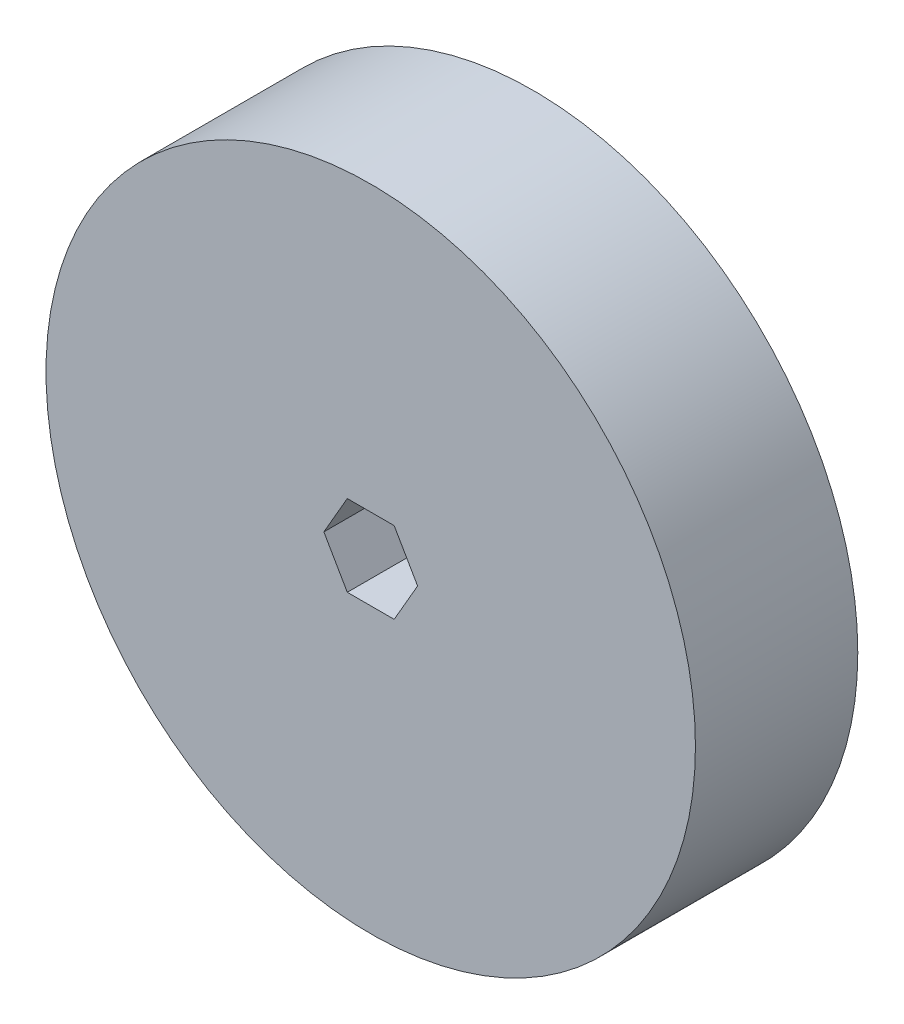
ISO-10303-21;
HEADER;
FILE_DESCRIPTION(('STEP AP214'),'2;1');
FILE_NAME('part.step','',(''),(''),'','','');
FILE_SCHEMA(('AUTOMOTIVE_DESIGN { 1 0 10303 214 1 1 1 1 }'));
ENDSEC;
DATA;
#1=APPLICATION_CONTEXT('core data for automotive mechanical design processes');
#2=APPLICATION_PROTOCOL_DEFINITION('international standard','automotive_design',2000,#1);
#3=PRODUCT_CONTEXT('',#1,'mechanical');
#4=PRODUCT('Part','Part','',(#3));
#5=PRODUCT_RELATED_PRODUCT_CATEGORY('part','',(#4));
#6=PRODUCT_DEFINITION_FORMATION('','',#4);
#7=PRODUCT_DEFINITION_CONTEXT('part definition',#1,'design');
#8=PRODUCT_DEFINITION('design','',#6,#7);
#9=PRODUCT_DEFINITION_SHAPE('','',#8);
#10=(LENGTH_UNIT() NAMED_UNIT(*) SI_UNIT(.MILLI.,.METRE.));
#11=(NAMED_UNIT(*) PLANE_ANGLE_UNIT() SI_UNIT($,.RADIAN.));
#12=(NAMED_UNIT(*) SI_UNIT($,.STERADIAN.) SOLID_ANGLE_UNIT());
#13=UNCERTAINTY_MEASURE_WITH_UNIT(LENGTH_MEASURE(1.E-05),#10,'distance_accuracy_value','');
#14=(GEOMETRIC_REPRESENTATION_CONTEXT(3) GLOBAL_UNCERTAINTY_ASSIGNED_CONTEXT((#13)) GLOBAL_UNIT_ASSIGNED_CONTEXT((#10,
#11,#12)) REPRESENTATION_CONTEXT('',''));
#15=CARTESIAN_POINT('',(0.,0.,0.));
#16=DIRECTION('',(0.,0.,1.));
#17=DIRECTION('',(1.,0.,0.));
#18=AXIS2_PLACEMENT_3D('',#15,#16,#17);
#19=CARTESIAN_POINT('',(0.,0.,25.4));
#20=DIRECTION('',(0.,0.,1.));
#21=DIRECTION('',(1.,0.,0.));
#22=AXIS2_PLACEMENT_3D('',#19,#20,#21);
#23=PLANE('',#22);
#24=CARTESIAN_POINT('',(0.,0.,25.4));
#25=DIRECTION('',(0.,0.,1.));
#26=DIRECTION('',(1.,0.,0.));
#27=AXIS2_PLACEMENT_3D('',#24,#25,#26);
#28=CIRCLE('',#27,50.8);
#29=CARTESIAN_POINT('',(50.8,0.,25.4));
#30=VERTEX_POINT('',#29);
#31=EDGE_CURVE('E11',#30,#30,#28,.T.);
#32=ORIENTED_EDGE('',*,*,#31,.T.);
#33=EDGE_LOOP('',(#32));
#34=FACE_BOUND('',#33,.T.);
#35=DIRECTION('',(-0.5,-0.866025403784438,0.));
#36=VECTOR('',#35,1.);
#37=CARTESIAN_POINT('',(-3.66617420935412,6.35,25.4));
#38=LINE('',#37,#36);
#39=CARTESIAN_POINT('',(-3.66617420935412,6.35,25.4));
#40=VERTEX_POINT('',#39);
#41=CARTESIAN_POINT('',(-7.33234841870825,0.,25.4));
#42=VERTEX_POINT('',#41);
#43=EDGE_CURVE('E106',#40,#42,#38,.T.);
#44=ORIENTED_EDGE('',*,*,#43,.F.);
#45=DIRECTION('',(-1.,0.,0.));
#46=VECTOR('',#45,1.);
#47=CARTESIAN_POINT('',(3.66617420935412,6.35,25.4));
#48=LINE('',#47,#46);
#49=CARTESIAN_POINT('',(3.66617420935412,6.35,25.4));
#50=VERTEX_POINT('',#49);
#51=EDGE_CURVE('E97',#50,#40,#48,.T.);
#52=ORIENTED_EDGE('',*,*,#51,.F.);
#53=DIRECTION('',(-0.5,0.866025403784439,0.));
#54=VECTOR('',#53,1.);
#55=CARTESIAN_POINT('',(7.33234841870825,0.,25.4));
#56=LINE('',#55,#54);
#57=CARTESIAN_POINT('',(7.33234841870825,0.,25.4));
#58=VERTEX_POINT('',#57);
#59=EDGE_CURVE('E131',#58,#50,#56,.T.);
#60=ORIENTED_EDGE('',*,*,#59,.F.);
#61=DIRECTION('',(0.5,0.866025403784438,0.));
#62=VECTOR('',#61,1.);
#63=CARTESIAN_POINT('',(3.66617420935413,-6.35,25.4));
#64=LINE('',#63,#62);
#65=CARTESIAN_POINT('',(3.66617420935413,-6.35,25.4));
#66=VERTEX_POINT('',#65);
#67=EDGE_CURVE('E128',#66,#58,#64,.T.);
#68=ORIENTED_EDGE('',*,*,#67,.F.);
#69=DIRECTION('',(1.,0.,0.));
#70=VECTOR('',#69,1.);
#71=CARTESIAN_POINT('',(-3.66617420935412,-6.35,25.4));
#72=LINE('',#71,#70);
#73=CARTESIAN_POINT('',(-3.66617420935412,-6.35,25.4));
#74=VERTEX_POINT('',#73);
#75=EDGE_CURVE('E123',#74,#66,#72,.T.);
#76=ORIENTED_EDGE('',*,*,#75,.F.);
#77=DIRECTION('',(0.5,-0.866025403784439,0.));
#78=VECTOR('',#77,1.);
#79=CARTESIAN_POINT('',(-7.33234841870825,0.,25.4));
#80=LINE('',#79,#78);
#81=EDGE_CURVE('E119',#42,#74,#80,.T.);
#82=ORIENTED_EDGE('',*,*,#81,.F.);
#83=EDGE_LOOP('',(#44,#52,#60,#68,#76,#82));
#84=FACE_BOUND('',#83,.T.);
#85=ADVANCED_FACE('F43',(#34,#84),#23,.T.);
#86=CARTESIAN_POINT('',(0.,0.,0.));
#87=DIRECTION('',(0.,0.,1.));
#88=DIRECTION('',(1.,0.,0.));
#89=AXIS2_PLACEMENT_3D('',#86,#87,#88);
#90=PLANE('',#89);
#91=CARTESIAN_POINT('',(0.,0.,0.));
#92=DIRECTION('',(0.,0.,1.));
#93=DIRECTION('',(1.,0.,0.));
#94=AXIS2_PLACEMENT_3D('',#91,#92,#93);
#95=CIRCLE('',#94,50.8);
#96=CARTESIAN_POINT('',(50.8,0.,0.));
#97=VERTEX_POINT('',#96);
#98=EDGE_CURVE('E47',#97,#97,#95,.T.);
#99=ORIENTED_EDGE('',*,*,#98,.F.);
#100=EDGE_LOOP('',(#99));
#101=FACE_BOUND('',#100,.T.);
#102=DIRECTION('',(-1.,0.,0.));
#103=VECTOR('',#102,1.);
#104=CARTESIAN_POINT('',(3.66617420935412,6.35,0.));
#105=LINE('',#104,#103);
#106=CARTESIAN_POINT('',(3.66617420935412,6.35,0.));
#107=VERTEX_POINT('',#106);
#108=CARTESIAN_POINT('',(-3.66617420935412,6.35,0.));
#109=VERTEX_POINT('',#108);
#110=EDGE_CURVE('E67',#107,#109,#105,.T.);
#111=ORIENTED_EDGE('',*,*,#110,.T.);
#112=DIRECTION('',(-0.5,-0.866025403784438,0.));
#113=VECTOR('',#112,1.);
#114=CARTESIAN_POINT('',(-3.66617420935412,6.35,0.));
#115=LINE('',#114,#113);
#116=CARTESIAN_POINT('',(-7.33234841870825,0.,0.));
#117=VERTEX_POINT('',#116);
#118=EDGE_CURVE('E113',#109,#117,#115,.T.);
#119=ORIENTED_EDGE('',*,*,#118,.T.);
#120=DIRECTION('',(0.5,-0.866025403784439,0.));
#121=VECTOR('',#120,1.);
#122=CARTESIAN_POINT('',(-7.33234841870825,0.,0.));
#123=LINE('',#122,#121);
#124=CARTESIAN_POINT('',(-3.66617420935412,-6.35,0.));
#125=VERTEX_POINT('',#124);
#126=EDGE_CURVE('E138',#117,#125,#123,.T.);
#127=ORIENTED_EDGE('',*,*,#126,.T.);
#128=DIRECTION('',(1.,0.,0.));
#129=VECTOR('',#128,1.);
#130=CARTESIAN_POINT('',(-3.66617420935412,-6.35,0.));
#131=LINE('',#130,#129);
#132=CARTESIAN_POINT('',(3.66617420935413,-6.35,0.));
#133=VERTEX_POINT('',#132);
#134=EDGE_CURVE('E142',#125,#133,#131,.T.);
#135=ORIENTED_EDGE('',*,*,#134,.T.);
#136=DIRECTION('',(0.5,0.866025403784438,0.));
#137=VECTOR('',#136,1.);
#138=CARTESIAN_POINT('',(3.66617420935413,-6.35,0.));
#139=LINE('',#138,#137);
#140=CARTESIAN_POINT('',(7.33234841870825,0.,0.));
#141=VERTEX_POINT('',#140);
#142=EDGE_CURVE('E146',#133,#141,#139,.T.);
#143=ORIENTED_EDGE('',*,*,#142,.T.);
#144=DIRECTION('',(-0.5,0.866025403784439,0.));
#145=VECTOR('',#144,1.);
#146=CARTESIAN_POINT('',(7.33234841870825,0.,0.));
#147=LINE('',#146,#145);
#148=EDGE_CURVE('E107',#141,#107,#147,.T.);
#149=ORIENTED_EDGE('',*,*,#148,.T.);
#150=EDGE_LOOP('',(#111,#119,#127,#135,#143,#149));
#151=FACE_BOUND('',#150,.T.);
#152=ADVANCED_FACE('F170',(#101,#151),#90,.F.);
#153=CARTESIAN_POINT('',(0.,0.,25.4));
#154=DIRECTION('',(0.,0.,-1.));
#155=DIRECTION('',(-1.,0.,0.));
#156=AXIS2_PLACEMENT_3D('',#153,#154,#155);
#157=CYLINDRICAL_SURFACE('',#156,50.8);
#158=ORIENTED_EDGE('',*,*,#31,.F.);
#159=EDGE_LOOP('',(#158));
#160=FACE_BOUND('',#159,.T.);
#161=ORIENTED_EDGE('',*,*,#98,.T.);
#162=EDGE_LOOP('',(#161));
#163=FACE_BOUND('',#162,.T.);
#164=ADVANCED_FACE('F45',(#160,#163),#157,.T.);
#165=CARTESIAN_POINT('',(3.66617420935412,6.35,25.4));
#166=DIRECTION('',(0.,-1.,0.));
#167=DIRECTION('',(0.,0.,-1.));
#168=AXIS2_PLACEMENT_3D('',#165,#166,#167);
#169=PLANE('',#168);
#170=ORIENTED_EDGE('',*,*,#110,.F.);
#171=DIRECTION('',(0.,0.,-1.));
#172=VECTOR('',#171,1.);
#173=CARTESIAN_POINT('',(3.66617420935412,6.35,25.4));
#174=LINE('',#173,#172);
#175=EDGE_CURVE('E101',#50,#107,#174,.T.);
#176=ORIENTED_EDGE('',*,*,#175,.F.);
#177=ORIENTED_EDGE('',*,*,#51,.T.);
#178=DIRECTION('',(0.,0.,-1.));
#179=VECTOR('',#178,1.);
#180=CARTESIAN_POINT('',(-3.66617420935412,6.35,25.4));
#181=LINE('',#180,#179);
#182=EDGE_CURVE('E100',#40,#109,#181,.T.);
#183=ORIENTED_EDGE('',*,*,#182,.T.);
#184=EDGE_LOOP('',(#170,#176,#177,#183));
#185=FACE_BOUND('',#184,.T.);
#186=ADVANCED_FACE('F99',(#185),#169,.T.);
#187=CARTESIAN_POINT('',(-3.66617420935412,6.35,25.4));
#188=DIRECTION('',(0.866025403784438,-0.5,0.));
#189=DIRECTION('',(0.5,0.866025403784439,0.));
#190=AXIS2_PLACEMENT_3D('',#187,#188,#189);
#191=PLANE('',#190);
#192=ORIENTED_EDGE('',*,*,#118,.F.);
#193=ORIENTED_EDGE('',*,*,#182,.F.);
#194=ORIENTED_EDGE('',*,*,#43,.T.);
#195=DIRECTION('',(0.,0.,-1.));
#196=VECTOR('',#195,1.);
#197=CARTESIAN_POINT('',(-7.33234841870825,0.,25.4));
#198=LINE('',#197,#196);
#199=EDGE_CURVE('E115',#42,#117,#198,.T.);
#200=ORIENTED_EDGE('',*,*,#199,.T.);
#201=EDGE_LOOP('',(#192,#193,#194,#200));
#202=FACE_BOUND('',#201,.T.);
#203=ADVANCED_FACE('F110',(#202),#191,.T.);
#204=CARTESIAN_POINT('',(-7.33234841870825,0.,25.4));
#205=DIRECTION('',(0.866025403784439,0.5,0.));
#206=DIRECTION('',(-0.5,0.866025403784439,0.));
#207=AXIS2_PLACEMENT_3D('',#204,#205,#206);
#208=PLANE('',#207);
#209=ORIENTED_EDGE('',*,*,#126,.F.);
#210=ORIENTED_EDGE('',*,*,#199,.F.);
#211=ORIENTED_EDGE('',*,*,#81,.T.);
#212=DIRECTION('',(0.,0.,-1.));
#213=VECTOR('',#212,1.);
#214=CARTESIAN_POINT('',(-3.66617420935412,-6.35,25.4));
#215=LINE('',#214,#213);
#216=EDGE_CURVE('E160',#74,#125,#215,.T.);
#217=ORIENTED_EDGE('',*,*,#216,.T.);
#218=EDGE_LOOP('',(#209,#210,#211,#217));
#219=FACE_BOUND('',#218,.T.);
#220=ADVANCED_FACE('F166',(#219),#208,.T.);
#221=CARTESIAN_POINT('',(-3.66617420935412,-6.35,25.4));
#222=DIRECTION('',(0.,1.,0.));
#223=DIRECTION('',(0.,0.,1.));
#224=AXIS2_PLACEMENT_3D('',#221,#222,#223);
#225=PLANE('',#224);
#226=ORIENTED_EDGE('',*,*,#134,.F.);
#227=ORIENTED_EDGE('',*,*,#216,.F.);
#228=ORIENTED_EDGE('',*,*,#75,.T.);
#229=DIRECTION('',(0.,0.,-1.));
#230=VECTOR('',#229,1.);
#231=CARTESIAN_POINT('',(3.66617420935413,-6.35,25.4));
#232=LINE('',#231,#230);
#233=EDGE_CURVE('E157',#66,#133,#232,.T.);
#234=ORIENTED_EDGE('',*,*,#233,.T.);
#235=EDGE_LOOP('',(#226,#227,#228,#234));
#236=FACE_BOUND('',#235,.T.);
#237=ADVANCED_FACE('F178',(#236),#225,.T.);
#238=CARTESIAN_POINT('',(3.66617420935413,-6.35,25.4));
#239=DIRECTION('',(-0.866025403784438,0.5,0.));
#240=DIRECTION('',(-0.5,-0.866025403784439,0.));
#241=AXIS2_PLACEMENT_3D('',#238,#239,#240);
#242=PLANE('',#241);
#243=ORIENTED_EDGE('',*,*,#142,.F.);
#244=ORIENTED_EDGE('',*,*,#233,.F.);
#245=ORIENTED_EDGE('',*,*,#67,.T.);
#246=DIRECTION('',(0.,0.,-1.));
#247=VECTOR('',#246,1.);
#248=CARTESIAN_POINT('',(7.33234841870825,0.,25.4));
#249=LINE('',#248,#247);
#250=EDGE_CURVE('E59',#58,#141,#249,.T.);
#251=ORIENTED_EDGE('',*,*,#250,.T.);
#252=EDGE_LOOP('',(#243,#244,#245,#251));
#253=FACE_BOUND('',#252,.T.);
#254=ADVANCED_FACE('F176',(#253),#242,.T.);
#255=CARTESIAN_POINT('',(7.33234841870825,0.,25.4));
#256=DIRECTION('',(-0.866025403784439,-0.5,0.));
#257=DIRECTION('',(0.5,-0.866025403784439,0.));
#258=AXIS2_PLACEMENT_3D('',#255,#256,#257);
#259=PLANE('',#258);
#260=ORIENTED_EDGE('',*,*,#148,.F.);
#261=ORIENTED_EDGE('',*,*,#250,.F.);
#262=ORIENTED_EDGE('',*,*,#59,.T.);
#263=ORIENTED_EDGE('',*,*,#175,.T.);
#264=EDGE_LOOP('',(#260,#261,#262,#263));
#265=FACE_BOUND('',#264,.T.);
#266=ADVANCED_FACE('F172',(#265),#259,.T.);
#267=CLOSED_SHELL('',(#85,#152,#164,#186,#203,#220,#237,#254,#266));
#268=MANIFOLD_SOLID_BREP('B2',#267);
#269=ADVANCED_BREP_SHAPE_REPRESENTATION('',(#18,#268),#14);
#270=SHAPE_DEFINITION_REPRESENTATION(#9,#269);
ENDSEC;
END-ISO-10303-21;
